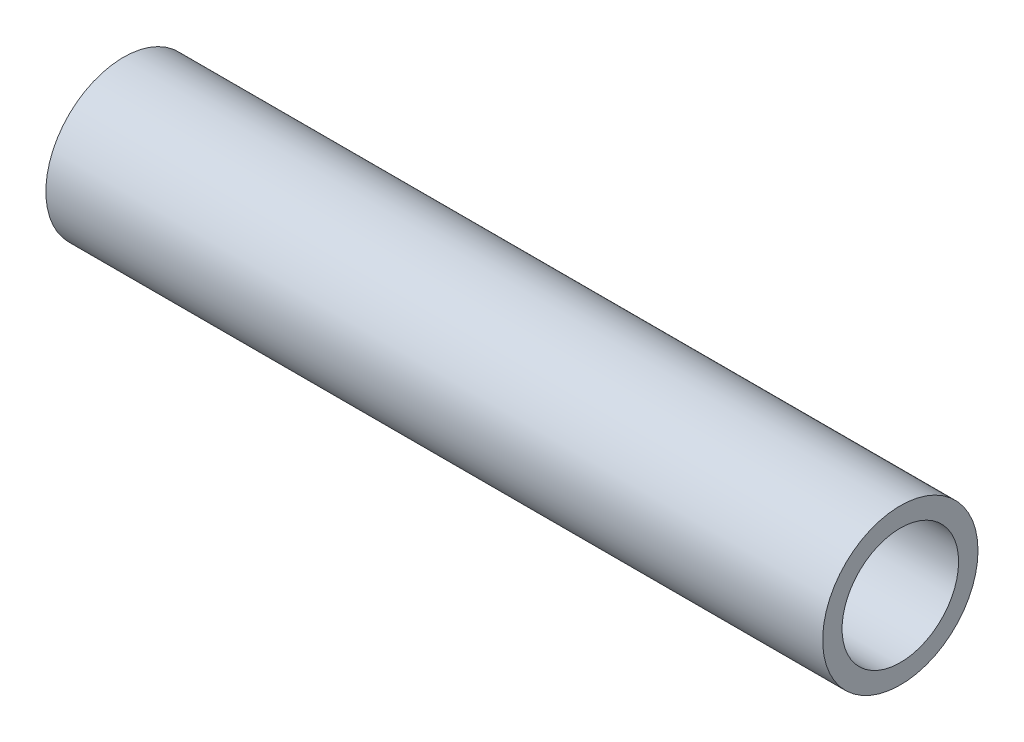
ISO-10303-21;
HEADER;
FILE_DESCRIPTION(('STEP AP214'),'2;1');
FILE_NAME('part.step','',(''),(''),'','','');
FILE_SCHEMA(('AUTOMOTIVE_DESIGN { 1 0 10303 214 1 1 1 1 }'));
ENDSEC;
DATA;
#1=APPLICATION_CONTEXT('core data for automotive mechanical design processes');
#2=APPLICATION_PROTOCOL_DEFINITION('international standard','automotive_design',2000,#1);
#3=PRODUCT_CONTEXT('',#1,'mechanical');
#4=PRODUCT('Part','Part','',(#3));
#5=PRODUCT_RELATED_PRODUCT_CATEGORY('part','',(#4));
#6=PRODUCT_DEFINITION_FORMATION('','',#4);
#7=PRODUCT_DEFINITION_CONTEXT('part definition',#1,'design');
#8=PRODUCT_DEFINITION('design','',#6,#7);
#9=PRODUCT_DEFINITION_SHAPE('','',#8);
#10=(LENGTH_UNIT() NAMED_UNIT(*) SI_UNIT(.MILLI.,.METRE.));
#11=(NAMED_UNIT(*) PLANE_ANGLE_UNIT() SI_UNIT($,.RADIAN.));
#12=(NAMED_UNIT(*) SI_UNIT($,.STERADIAN.) SOLID_ANGLE_UNIT());
#13=UNCERTAINTY_MEASURE_WITH_UNIT(LENGTH_MEASURE(1.E-05),#10,'distance_accuracy_value','');
#14=(GEOMETRIC_REPRESENTATION_CONTEXT(3) GLOBAL_UNCERTAINTY_ASSIGNED_CONTEXT((#13)) GLOBAL_UNIT_ASSIGNED_CONTEXT((#10,
#11,#12)) REPRESENTATION_CONTEXT('',''));
#15=CARTESIAN_POINT('',(0.,0.,0.));
#16=DIRECTION('',(0.,0.,1.));
#17=DIRECTION('',(1.,0.,0.));
#18=AXIS2_PLACEMENT_3D('',#15,#16,#17);
#19=CARTESIAN_POINT('',(20.,0.,0.));
#20=DIRECTION('',(1.,0.,0.));
#21=DIRECTION('',(0.,0.,-1.));
#22=AXIS2_PLACEMENT_3D('',#19,#20,#21);
#23=PLANE('',#22);
#24=CARTESIAN_POINT('',(20.,0.,0.));
#25=DIRECTION('',(1.,0.,0.));
#26=DIRECTION('',(0.,0.,-1.));
#27=AXIS2_PLACEMENT_3D('',#24,#25,#26);
#28=CIRCLE('',#27,2.);
#29=CARTESIAN_POINT('',(20.,0.,-2.));
#30=VERTEX_POINT('',#29);
#31=EDGE_CURVE('E10',#30,#30,#28,.T.);
#32=ORIENTED_EDGE('',*,*,#31,.T.);
#33=EDGE_LOOP('',(#32));
#34=FACE_BOUND('',#33,.T.);
#35=CARTESIAN_POINT('',(20.,0.,0.));
#36=DIRECTION('',(1.,0.,0.));
#37=DIRECTION('',(0.,0.,-1.));
#38=AXIS2_PLACEMENT_3D('',#35,#36,#37);
#39=CIRCLE('',#38,1.5);
#40=CARTESIAN_POINT('',(20.,0.,-1.5));
#41=VERTEX_POINT('',#40);
#42=EDGE_CURVE('E54',#41,#41,#39,.T.);
#43=ORIENTED_EDGE('',*,*,#42,.F.);
#44=EDGE_LOOP('',(#43));
#45=FACE_BOUND('',#44,.T.);
#46=ADVANCED_FACE('F41',(#34,#45),#23,.T.);
#47=CARTESIAN_POINT('',(0.,0.,0.));
#48=DIRECTION('',(1.,0.,0.));
#49=DIRECTION('',(0.,0.,-1.));
#50=AXIS2_PLACEMENT_3D('',#47,#48,#49);
#51=PLANE('',#50);
#52=CARTESIAN_POINT('',(0.,0.,0.));
#53=DIRECTION('',(1.,0.,0.));
#54=DIRECTION('',(0.,0.,-1.));
#55=AXIS2_PLACEMENT_3D('',#52,#53,#54);
#56=CIRCLE('',#55,2.);
#57=CARTESIAN_POINT('',(0.,0.,-2.));
#58=VERTEX_POINT('',#57);
#59=EDGE_CURVE('E45',#58,#58,#56,.T.);
#60=ORIENTED_EDGE('',*,*,#59,.F.);
#61=EDGE_LOOP('',(#60));
#62=FACE_BOUND('',#61,.T.);
#63=CARTESIAN_POINT('',(0.,0.,0.));
#64=DIRECTION('',(1.,0.,0.));
#65=DIRECTION('',(0.,0.,-1.));
#66=AXIS2_PLACEMENT_3D('',#63,#64,#65);
#67=CIRCLE('',#66,1.5);
#68=CARTESIAN_POINT('',(0.,0.,-1.5));
#69=VERTEX_POINT('',#68);
#70=EDGE_CURVE('E56',#69,#69,#67,.T.);
#71=ORIENTED_EDGE('',*,*,#70,.T.);
#72=EDGE_LOOP('',(#71));
#73=FACE_BOUND('',#72,.T.);
#74=ADVANCED_FACE('F68',(#62,#73),#51,.F.);
#75=CARTESIAN_POINT('',(20.,0.,0.));
#76=DIRECTION('',(-1.,0.,0.));
#77=DIRECTION('',(0.,0.,1.));
#78=AXIS2_PLACEMENT_3D('',#75,#76,#77);
#79=CYLINDRICAL_SURFACE('',#78,2.);
#80=ORIENTED_EDGE('',*,*,#31,.F.);
#81=EDGE_LOOP('',(#80));
#82=FACE_BOUND('',#81,.T.);
#83=ORIENTED_EDGE('',*,*,#59,.T.);
#84=EDGE_LOOP('',(#83));
#85=FACE_BOUND('',#84,.T.);
#86=ADVANCED_FACE('F43',(#82,#85),#79,.T.);
#87=CARTESIAN_POINT('',(20.,0.,0.));
#88=DIRECTION('',(-1.,0.,0.));
#89=DIRECTION('',(0.,0.,1.));
#90=AXIS2_PLACEMENT_3D('',#87,#88,#89);
#91=CYLINDRICAL_SURFACE('',#90,1.5);
#92=ORIENTED_EDGE('',*,*,#42,.T.);
#93=EDGE_LOOP('',(#92));
#94=FACE_BOUND('',#93,.T.);
#95=ORIENTED_EDGE('',*,*,#70,.F.);
#96=EDGE_LOOP('',(#95));
#97=FACE_BOUND('',#96,.T.);
#98=ADVANCED_FACE('F64',(#94,#97),#91,.F.);
#99=CLOSED_SHELL('',(#46,#74,#86,#98));
#100=MANIFOLD_SOLID_BREP('B2',#99);
#101=ADVANCED_BREP_SHAPE_REPRESENTATION('',(#18,#100),#14);
#102=SHAPE_DEFINITION_REPRESENTATION(#9,#101);
ENDSEC;
END-ISO-10303-21;
